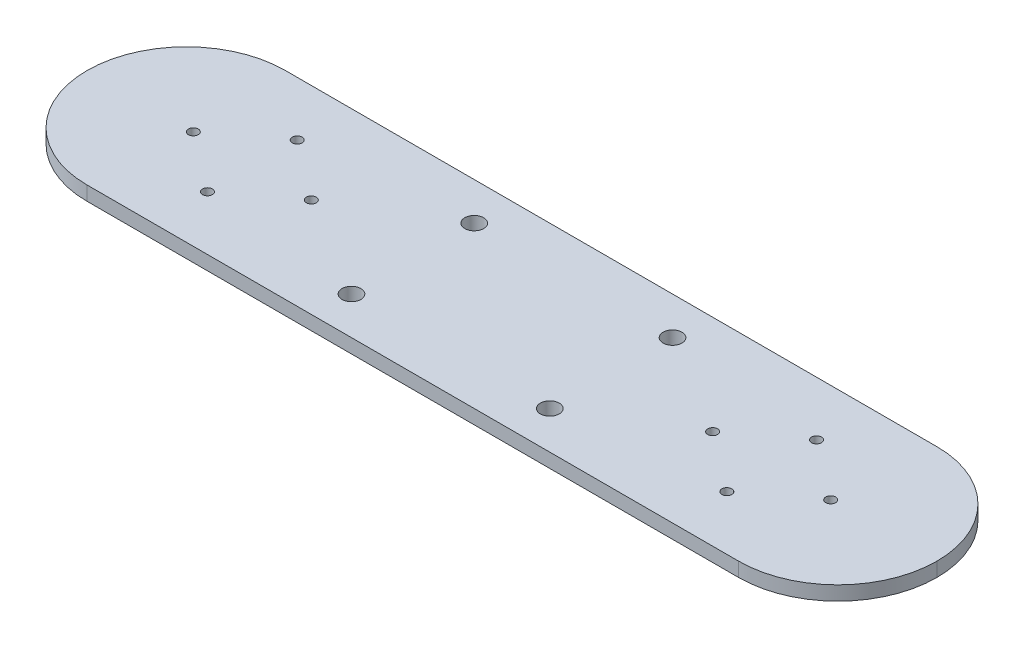
ISO-10303-21;
HEADER;
FILE_DESCRIPTION(('STEP AP214'),'2;1');
FILE_NAME('part.step','',(''),(''),'','','');
FILE_SCHEMA(('AUTOMOTIVE_DESIGN { 1 0 10303 214 1 1 1 1 }'));
ENDSEC;
DATA;
#1=APPLICATION_CONTEXT('core data for automotive mechanical design processes');
#2=APPLICATION_PROTOCOL_DEFINITION('international standard','automotive_design',2000,#1);
#3=PRODUCT_CONTEXT('',#1,'mechanical');
#4=PRODUCT('Part','Part','',(#3));
#5=PRODUCT_RELATED_PRODUCT_CATEGORY('part','',(#4));
#6=PRODUCT_DEFINITION_FORMATION('','',#4);
#7=PRODUCT_DEFINITION_CONTEXT('part definition',#1,'design');
#8=PRODUCT_DEFINITION('design','',#6,#7);
#9=PRODUCT_DEFINITION_SHAPE('','',#8);
#10=(LENGTH_UNIT() NAMED_UNIT(*) SI_UNIT(.MILLI.,.METRE.));
#11=(NAMED_UNIT(*) PLANE_ANGLE_UNIT() SI_UNIT($,.RADIAN.));
#12=(NAMED_UNIT(*) SI_UNIT($,.STERADIAN.) SOLID_ANGLE_UNIT());
#13=UNCERTAINTY_MEASURE_WITH_UNIT(LENGTH_MEASURE(1.E-05),#10,'distance_accuracy_value','');
#14=(GEOMETRIC_REPRESENTATION_CONTEXT(3) GLOBAL_UNCERTAINTY_ASSIGNED_CONTEXT((#13)) GLOBAL_UNIT_ASSIGNED_CONTEXT((#10,
#11,#12)) REPRESENTATION_CONTEXT('',''));
#15=CARTESIAN_POINT('',(0.,0.,0.));
#16=DIRECTION('',(0.,0.,1.));
#17=DIRECTION('',(1.,0.,0.));
#18=AXIS2_PLACEMENT_3D('',#15,#16,#17);
#19=CARTESIAN_POINT('',(-89.9999999999999,1.5,21.));
#20=DIRECTION('',(0.,-1.,0.));
#21=DIRECTION('',(0.,0.,-1.));
#22=AXIS2_PLACEMENT_3D('',#19,#20,#21);
#23=PLANE('',#22);
#24=CARTESIAN_POINT('',(-55.,1.5,9.5));
#25=DIRECTION('',(0.,-1.,0.));
#26=DIRECTION('',(0.,0.,1.));
#27=AXIS2_PLACEMENT_3D('',#24,#25,#26);
#28=CIRCLE('',#27,1.04999999999999);
#29=CARTESIAN_POINT('',(-55.,1.5,10.55));
#30=VERTEX_POINT('',#29);
#31=EDGE_CURVE('E232',#30,#30,#28,.T.);
#32=ORIENTED_EDGE('',*,*,#31,.T.);
#33=EDGE_LOOP('',(#32));
#34=FACE_BOUND('',#33,.T.);
#35=CARTESIAN_POINT('',(-42.5,1.5,0.));
#36=DIRECTION('',(0.,-1.,0.));
#37=DIRECTION('',(0.,0.,1.));
#38=AXIS2_PLACEMENT_3D('',#35,#36,#37);
#39=CIRCLE('',#38,1.05);
#40=CARTESIAN_POINT('',(-42.5,1.5,1.05));
#41=VERTEX_POINT('',#40);
#42=EDGE_CURVE('E230',#41,#41,#39,.T.);
#43=ORIENTED_EDGE('',*,*,#42,.T.);
#44=EDGE_LOOP('',(#43));
#45=FACE_BOUND('',#44,.T.);
#46=CARTESIAN_POINT('',(-67.5,1.5,0.));
#47=DIRECTION('',(0.,-1.,0.));
#48=DIRECTION('',(0.,0.,1.));
#49=AXIS2_PLACEMENT_3D('',#46,#47,#48);
#50=CIRCLE('',#49,1.04999999999999);
#51=CARTESIAN_POINT('',(-67.5,1.5,1.04999999999999));
#52=VERTEX_POINT('',#51);
#53=EDGE_CURVE('E135',#52,#52,#50,.T.);
#54=ORIENTED_EDGE('',*,*,#53,.T.);
#55=EDGE_LOOP('',(#54));
#56=FACE_BOUND('',#55,.T.);
#57=CARTESIAN_POINT('',(-55.,1.5,-9.5));
#58=DIRECTION('',(0.,-1.,0.));
#59=DIRECTION('',(0.,0.,1.));
#60=AXIS2_PLACEMENT_3D('',#57,#58,#59);
#61=CIRCLE('',#60,1.04999999999999);
#62=CARTESIAN_POINT('',(-55.,1.5,-8.45));
#63=VERTEX_POINT('',#62);
#64=EDGE_CURVE('E242',#63,#63,#61,.T.);
#65=ORIENTED_EDGE('',*,*,#64,.T.);
#66=EDGE_LOOP('',(#65));
#67=FACE_BOUND('',#66,.T.);
#68=CARTESIAN_POINT('',(55.,1.5,9.5));
#69=DIRECTION('',(0.,1.,0.));
#70=DIRECTION('',(0.,0.,1.));
#71=AXIS2_PLACEMENT_3D('',#68,#69,#70);
#72=CIRCLE('',#71,1.04999999999999);
#73=CARTESIAN_POINT('',(55.,1.5,10.55));
#74=VERTEX_POINT('',#73);
#75=EDGE_CURVE('E250',#74,#74,#72,.T.);
#76=ORIENTED_EDGE('',*,*,#75,.F.);
#77=EDGE_LOOP('',(#76));
#78=FACE_BOUND('',#77,.T.);
#79=CARTESIAN_POINT('',(42.5,1.5,0.));
#80=DIRECTION('',(0.,1.,0.));
#81=DIRECTION('',(0.,0.,1.));
#82=AXIS2_PLACEMENT_3D('',#79,#80,#81);
#83=CIRCLE('',#82,1.05);
#84=CARTESIAN_POINT('',(42.5,1.5,1.05));
#85=VERTEX_POINT('',#84);
#86=EDGE_CURVE('E256',#85,#85,#83,.T.);
#87=ORIENTED_EDGE('',*,*,#86,.F.);
#88=EDGE_LOOP('',(#87));
#89=FACE_BOUND('',#88,.T.);
#90=CARTESIAN_POINT('',(67.5,1.5,0.));
#91=DIRECTION('',(0.,1.,0.));
#92=DIRECTION('',(0.,0.,1.));
#93=AXIS2_PLACEMENT_3D('',#90,#91,#92);
#94=CIRCLE('',#93,1.04999999999999);
#95=CARTESIAN_POINT('',(67.5,1.5,1.04999999999999));
#96=VERTEX_POINT('',#95);
#97=EDGE_CURVE('E241',#96,#96,#94,.T.);
#98=ORIENTED_EDGE('',*,*,#97,.F.);
#99=EDGE_LOOP('',(#98));
#100=FACE_BOUND('',#99,.T.);
#101=CARTESIAN_POINT('',(55.,1.5,-9.5));
#102=DIRECTION('',(0.,1.,0.));
#103=DIRECTION('',(0.,0.,1.));
#104=AXIS2_PLACEMENT_3D('',#101,#102,#103);
#105=CIRCLE('',#104,1.04999999999999);
#106=CARTESIAN_POINT('',(55.,1.5,-8.45));
#107=VERTEX_POINT('',#106);
#108=EDGE_CURVE('E249',#107,#107,#105,.T.);
#109=ORIENTED_EDGE('',*,*,#108,.F.);
#110=EDGE_LOOP('',(#109));
#111=FACE_BOUND('',#110,.T.);
#112=CARTESIAN_POINT('',(21.,1.5,-13.));
#113=DIRECTION('',(0.,1.,0.));
#114=DIRECTION('',(0.,0.,1.));
#115=AXIS2_PLACEMENT_3D('',#112,#113,#114);
#116=CIRCLE('',#115,2.);
#117=CARTESIAN_POINT('',(21.,1.5,-11.));
#118=VERTEX_POINT('',#117);
#119=EDGE_CURVE('E273',#118,#118,#116,.T.);
#120=ORIENTED_EDGE('',*,*,#119,.F.);
#121=EDGE_LOOP('',(#120));
#122=FACE_BOUND('',#121,.T.);
#123=CARTESIAN_POINT('',(21.,1.5,13.));
#124=DIRECTION('',(0.,1.,0.));
#125=DIRECTION('',(0.,0.,1.));
#126=AXIS2_PLACEMENT_3D('',#123,#124,#125);
#127=CIRCLE('',#126,2.);
#128=CARTESIAN_POINT('',(21.,1.5,15.));
#129=VERTEX_POINT('',#128);
#130=EDGE_CURVE('E279',#129,#129,#127,.T.);
#131=ORIENTED_EDGE('',*,*,#130,.F.);
#132=EDGE_LOOP('',(#131));
#133=FACE_BOUND('',#132,.T.);
#134=CARTESIAN_POINT('',(-21.,1.5,13.));
#135=DIRECTION('',(0.,1.,0.));
#136=DIRECTION('',(0.,0.,1.));
#137=AXIS2_PLACEMENT_3D('',#134,#135,#136);
#138=CIRCLE('',#137,2.);
#139=CARTESIAN_POINT('',(-21.,1.5,15.));
#140=VERTEX_POINT('',#139);
#141=EDGE_CURVE('E267',#140,#140,#138,.T.);
#142=ORIENTED_EDGE('',*,*,#141,.F.);
#143=EDGE_LOOP('',(#142));
#144=FACE_BOUND('',#143,.T.);
#145=CARTESIAN_POINT('',(-21.,1.5,-13.));
#146=DIRECTION('',(0.,1.,0.));
#147=DIRECTION('',(0.,0.,1.));
#148=AXIS2_PLACEMENT_3D('',#145,#146,#147);
#149=CIRCLE('',#148,2.);
#150=CARTESIAN_POINT('',(-21.,1.5,-11.));
#151=VERTEX_POINT('',#150);
#152=EDGE_CURVE('E119',#151,#151,#149,.T.);
#153=ORIENTED_EDGE('',*,*,#152,.F.);
#154=EDGE_LOOP('',(#153));
#155=FACE_BOUND('',#154,.T.);
#156=CARTESIAN_POINT('',(-68.9999999999999,1.5,0.));
#157=DIRECTION('',(0.,-1.,0.));
#158=DIRECTION('',(0.,0.,-1.));
#159=AXIS2_PLACEMENT_3D('',#156,#157,#158);
#160=CIRCLE('',#159,21.);
#161=CARTESIAN_POINT('',(-68.9999999999999,1.5,-21.));
#162=VERTEX_POINT('',#161);
#163=CARTESIAN_POINT('',(-89.9999999999999,1.5,0.));
#164=VERTEX_POINT('',#163);
#165=EDGE_CURVE('E98',#162,#164,#160,.F.);
#166=ORIENTED_EDGE('',*,*,#165,.T.);
#167=CARTESIAN_POINT('',(-68.9999999999999,1.5,0.));
#168=DIRECTION('',(0.,-1.,0.));
#169=DIRECTION('',(0.,0.,-1.));
#170=AXIS2_PLACEMENT_3D('',#167,#168,#169);
#171=CIRCLE('',#170,21.);
#172=CARTESIAN_POINT('',(-68.9999999999999,1.5,21.));
#173=VERTEX_POINT('',#172);
#174=EDGE_CURVE('E112',#164,#173,#171,.F.);
#175=ORIENTED_EDGE('',*,*,#174,.T.);
#176=DIRECTION('',(-1.,0.,0.));
#177=VECTOR('',#176,1.);
#178=CARTESIAN_POINT('',(-89.9999999999999,1.5,21.));
#179=LINE('',#178,#177);
#180=CARTESIAN_POINT('',(69.,1.5,21.));
#181=VERTEX_POINT('',#180);
#182=EDGE_CURVE('E106',#181,#173,#179,.T.);
#183=ORIENTED_EDGE('',*,*,#182,.F.);
#184=CARTESIAN_POINT('',(69.0000000000001,1.5,0.));
#185=DIRECTION('',(0.,-1.,0.));
#186=DIRECTION('',(0.,0.,-1.));
#187=AXIS2_PLACEMENT_3D('',#184,#185,#186);
#188=CIRCLE('',#187,21.);
#189=CARTESIAN_POINT('',(90.0000000000001,1.5,0.));
#190=VERTEX_POINT('',#189);
#191=EDGE_CURVE('E89',#181,#190,#188,.F.);
#192=ORIENTED_EDGE('',*,*,#191,.T.);
#193=CARTESIAN_POINT('',(69.0000000000001,1.5,0.));
#194=DIRECTION('',(0.,-1.,0.));
#195=DIRECTION('',(0.,0.,-1.));
#196=AXIS2_PLACEMENT_3D('',#193,#194,#195);
#197=CIRCLE('',#196,21.);
#198=CARTESIAN_POINT('',(69.,1.5,-21.));
#199=VERTEX_POINT('',#198);
#200=EDGE_CURVE('E99',#190,#199,#197,.F.);
#201=ORIENTED_EDGE('',*,*,#200,.T.);
#202=DIRECTION('',(-1.,0.,0.));
#203=VECTOR('',#202,1.);
#204=CARTESIAN_POINT('',(-89.9999999999999,1.5,-21.));
#205=LINE('',#204,#203);
#206=EDGE_CURVE('E116',#199,#162,#205,.T.);
#207=ORIENTED_EDGE('',*,*,#206,.T.);
#208=EDGE_LOOP('',(#166,#175,#183,#192,#201,#207));
#209=FACE_BOUND('',#208,.T.);
#210=ADVANCED_FACE('F35',(#34,#45,#56,#67,#78,#89,#100,#111,#122,#133,#144,#155,#209),#23,.F.);
#211=CARTESIAN_POINT('',(-89.9999999999999,-1.5,21.));
#212=DIRECTION('',(0.,1.,0.));
#213=DIRECTION('',(0.,0.,1.));
#214=AXIS2_PLACEMENT_3D('',#211,#212,#213);
#215=PLANE('',#214);
#216=CARTESIAN_POINT('',(-55.,-1.5,9.5));
#217=DIRECTION('',(0.,-1.,0.));
#218=DIRECTION('',(0.,0.,1.));
#219=AXIS2_PLACEMENT_3D('',#216,#217,#218);
#220=CIRCLE('',#219,1.04999999999999);
#221=CARTESIAN_POINT('',(-55.,-1.5,10.55));
#222=VERTEX_POINT('',#221);
#223=EDGE_CURVE('E245',#222,#222,#220,.T.);
#224=ORIENTED_EDGE('',*,*,#223,.F.);
#225=EDGE_LOOP('',(#224));
#226=FACE_BOUND('',#225,.T.);
#227=CARTESIAN_POINT('',(-42.5,-1.5,0.));
#228=DIRECTION('',(0.,-1.,0.));
#229=DIRECTION('',(0.,0.,1.));
#230=AXIS2_PLACEMENT_3D('',#227,#228,#229);
#231=CIRCLE('',#230,1.05);
#232=CARTESIAN_POINT('',(-42.5,-1.5,1.05));
#233=VERTEX_POINT('',#232);
#234=EDGE_CURVE('E227',#233,#233,#231,.T.);
#235=ORIENTED_EDGE('',*,*,#234,.F.);
#236=EDGE_LOOP('',(#235));
#237=FACE_BOUND('',#236,.T.);
#238=CARTESIAN_POINT('',(-67.5,-1.5,0.));
#239=DIRECTION('',(0.,-1.,0.));
#240=DIRECTION('',(0.,0.,1.));
#241=AXIS2_PLACEMENT_3D('',#238,#239,#240);
#242=CIRCLE('',#241,1.04999999999999);
#243=CARTESIAN_POINT('',(-67.5,-1.5,1.04999999999999));
#244=VERTEX_POINT('',#243);
#245=EDGE_CURVE('E137',#244,#244,#242,.T.);
#246=ORIENTED_EDGE('',*,*,#245,.F.);
#247=EDGE_LOOP('',(#246));
#248=FACE_BOUND('',#247,.T.);
#249=CARTESIAN_POINT('',(-55.,-1.5,-9.5));
#250=DIRECTION('',(0.,-1.,0.));
#251=DIRECTION('',(0.,0.,1.));
#252=AXIS2_PLACEMENT_3D('',#249,#250,#251);
#253=CIRCLE('',#252,1.04999999999999);
#254=CARTESIAN_POINT('',(-55.,-1.5,-8.45));
#255=VERTEX_POINT('',#254);
#256=EDGE_CURVE('E238',#255,#255,#253,.T.);
#257=ORIENTED_EDGE('',*,*,#256,.F.);
#258=EDGE_LOOP('',(#257));
#259=FACE_BOUND('',#258,.T.);
#260=CARTESIAN_POINT('',(55.,-1.5,9.5));
#261=DIRECTION('',(0.,1.,0.));
#262=DIRECTION('',(0.,0.,1.));
#263=AXIS2_PLACEMENT_3D('',#260,#261,#262);
#264=CIRCLE('',#263,1.04999999999999);
#265=CARTESIAN_POINT('',(55.,-1.5,10.55));
#266=VERTEX_POINT('',#265);
#267=EDGE_CURVE('E246',#266,#266,#264,.T.);
#268=ORIENTED_EDGE('',*,*,#267,.T.);
#269=EDGE_LOOP('',(#268));
#270=FACE_BOUND('',#269,.T.);
#271=CARTESIAN_POINT('',(42.5,-1.5,0.));
#272=DIRECTION('',(0.,1.,0.));
#273=DIRECTION('',(0.,0.,1.));
#274=AXIS2_PLACEMENT_3D('',#271,#272,#273);
#275=CIRCLE('',#274,1.05);
#276=CARTESIAN_POINT('',(42.5,-1.5,1.05));
#277=VERTEX_POINT('',#276);
#278=EDGE_CURVE('E253',#277,#277,#275,.T.);
#279=ORIENTED_EDGE('',*,*,#278,.T.);
#280=EDGE_LOOP('',(#279));
#281=FACE_BOUND('',#280,.T.);
#282=CARTESIAN_POINT('',(67.5,-1.5,0.));
#283=DIRECTION('',(0.,1.,0.));
#284=DIRECTION('',(0.,0.,1.));
#285=AXIS2_PLACEMENT_3D('',#282,#283,#284);
#286=CIRCLE('',#285,1.04999999999999);
#287=CARTESIAN_POINT('',(67.5,-1.5,1.04999999999999));
#288=VERTEX_POINT('',#287);
#289=EDGE_CURVE('E259',#288,#288,#286,.T.);
#290=ORIENTED_EDGE('',*,*,#289,.T.);
#291=EDGE_LOOP('',(#290));
#292=FACE_BOUND('',#291,.T.);
#293=CARTESIAN_POINT('',(55.,-1.5,-9.5));
#294=DIRECTION('',(0.,1.,0.));
#295=DIRECTION('',(0.,0.,1.));
#296=AXIS2_PLACEMENT_3D('',#293,#294,#295);
#297=CIRCLE('',#296,1.04999999999999);
#298=CARTESIAN_POINT('',(55.,-1.5,-8.45));
#299=VERTEX_POINT('',#298);
#300=EDGE_CURVE('E264',#299,#299,#297,.T.);
#301=ORIENTED_EDGE('',*,*,#300,.T.);
#302=EDGE_LOOP('',(#301));
#303=FACE_BOUND('',#302,.T.);
#304=CARTESIAN_POINT('',(21.,-1.5,-13.));
#305=DIRECTION('',(0.,1.,0.));
#306=DIRECTION('',(0.,0.,1.));
#307=AXIS2_PLACEMENT_3D('',#304,#305,#306);
#308=CIRCLE('',#307,2.);
#309=CARTESIAN_POINT('',(21.,-1.5,-11.));
#310=VERTEX_POINT('',#309);
#311=EDGE_CURVE('E270',#310,#310,#308,.T.);
#312=ORIENTED_EDGE('',*,*,#311,.T.);
#313=EDGE_LOOP('',(#312));
#314=FACE_BOUND('',#313,.T.);
#315=CARTESIAN_POINT('',(21.,-1.5,13.));
#316=DIRECTION('',(0.,1.,0.));
#317=DIRECTION('',(0.,0.,1.));
#318=AXIS2_PLACEMENT_3D('',#315,#316,#317);
#319=CIRCLE('',#318,2.);
#320=CARTESIAN_POINT('',(21.,-1.5,15.));
#321=VERTEX_POINT('',#320);
#322=EDGE_CURVE('E276',#321,#321,#319,.T.);
#323=ORIENTED_EDGE('',*,*,#322,.T.);
#324=EDGE_LOOP('',(#323));
#325=FACE_BOUND('',#324,.T.);
#326=CARTESIAN_POINT('',(-21.,-1.5,13.));
#327=DIRECTION('',(0.,1.,0.));
#328=DIRECTION('',(0.,0.,1.));
#329=AXIS2_PLACEMENT_3D('',#326,#327,#328);
#330=CIRCLE('',#329,2.);
#331=CARTESIAN_POINT('',(-21.,-1.5,15.));
#332=VERTEX_POINT('',#331);
#333=EDGE_CURVE('E282',#332,#332,#330,.T.);
#334=ORIENTED_EDGE('',*,*,#333,.T.);
#335=EDGE_LOOP('',(#334));
#336=FACE_BOUND('',#335,.T.);
#337=CARTESIAN_POINT('',(-21.,-1.5,-13.));
#338=DIRECTION('',(0.,1.,0.));
#339=DIRECTION('',(0.,0.,1.));
#340=AXIS2_PLACEMENT_3D('',#337,#338,#339);
#341=CIRCLE('',#340,2.);
#342=CARTESIAN_POINT('',(-21.,-1.5,-11.));
#343=VERTEX_POINT('',#342);
#344=EDGE_CURVE('E123',#343,#343,#341,.T.);
#345=ORIENTED_EDGE('',*,*,#344,.T.);
#346=EDGE_LOOP('',(#345));
#347=FACE_BOUND('',#346,.T.);
#348=DIRECTION('',(1.,0.,0.));
#349=VECTOR('',#348,1.);
#350=CARTESIAN_POINT('',(-89.9999999999999,-1.5,21.));
#351=LINE('',#350,#349);
#352=CARTESIAN_POINT('',(-68.9999999999999,-1.5,21.));
#353=VERTEX_POINT('',#352);
#354=CARTESIAN_POINT('',(69.,-1.5,21.));
#355=VERTEX_POINT('',#354);
#356=EDGE_CURVE('E108',#353,#355,#351,.T.);
#357=ORIENTED_EDGE('',*,*,#356,.F.);
#358=CARTESIAN_POINT('',(-68.9999999999999,-1.5,0.));
#359=DIRECTION('',(0.,1.,0.));
#360=DIRECTION('',(0.,0.,1.));
#361=AXIS2_PLACEMENT_3D('',#358,#359,#360);
#362=CIRCLE('',#361,21.);
#363=CARTESIAN_POINT('',(-89.9999999999999,-1.5,0.));
#364=VERTEX_POINT('',#363);
#365=EDGE_CURVE('E52',#353,#364,#362,.F.);
#366=ORIENTED_EDGE('',*,*,#365,.T.);
#367=CARTESIAN_POINT('',(-68.9999999999999,-1.5,0.));
#368=DIRECTION('',(0.,1.,0.));
#369=DIRECTION('',(0.,0.,1.));
#370=AXIS2_PLACEMENT_3D('',#367,#368,#369);
#371=CIRCLE('',#370,21.);
#372=CARTESIAN_POINT('',(-68.9999999999999,-1.5,-21.));
#373=VERTEX_POINT('',#372);
#374=EDGE_CURVE('E132',#364,#373,#371,.F.);
#375=ORIENTED_EDGE('',*,*,#374,.T.);
#376=DIRECTION('',(1.,0.,0.));
#377=VECTOR('',#376,1.);
#378=CARTESIAN_POINT('',(-89.9999999999999,-1.5,-21.));
#379=LINE('',#378,#377);
#380=CARTESIAN_POINT('',(69.,-1.5,-21.));
#381=VERTEX_POINT('',#380);
#382=EDGE_CURVE('E113',#373,#381,#379,.T.);
#383=ORIENTED_EDGE('',*,*,#382,.T.);
#384=CARTESIAN_POINT('',(69.0000000000001,-1.5,0.));
#385=DIRECTION('',(0.,1.,0.));
#386=DIRECTION('',(0.,0.,1.));
#387=AXIS2_PLACEMENT_3D('',#384,#385,#386);
#388=CIRCLE('',#387,21.);
#389=CARTESIAN_POINT('',(90.0000000000001,-1.5,0.));
#390=VERTEX_POINT('',#389);
#391=EDGE_CURVE('E59',#381,#390,#388,.F.);
#392=ORIENTED_EDGE('',*,*,#391,.T.);
#393=CARTESIAN_POINT('',(69.0000000000001,-1.5,0.));
#394=DIRECTION('',(0.,1.,0.));
#395=DIRECTION('',(0.,0.,1.));
#396=AXIS2_PLACEMENT_3D('',#393,#394,#395);
#397=CIRCLE('',#396,21.);
#398=EDGE_CURVE('E130',#390,#355,#397,.F.);
#399=ORIENTED_EDGE('',*,*,#398,.T.);
#400=EDGE_LOOP('',(#357,#366,#375,#383,#392,#399));
#401=FACE_BOUND('',#400,.T.);
#402=ADVANCED_FACE('F147',(#226,#237,#248,#259,#270,#281,#292,#303,#314,#325,#336,#347,#401),
#215,.F.);
#403=CARTESIAN_POINT('',(0.,0.,21.));
#404=DIRECTION('',(0.,0.,-1.));
#405=DIRECTION('',(-1.,0.,0.));
#406=AXIS2_PLACEMENT_3D('',#403,#404,#405);
#407=PLANE('',#406);
#408=ORIENTED_EDGE('',*,*,#356,.T.);
#409=DIRECTION('',(0.,1.,0.));
#410=VECTOR('',#409,1.);
#411=CARTESIAN_POINT('',(69.0000000000001,0.,21.));
#412=LINE('',#411,#410);
#413=EDGE_CURVE('E93',#355,#181,#412,.T.);
#414=ORIENTED_EDGE('',*,*,#413,.T.);
#415=ORIENTED_EDGE('',*,*,#182,.T.);
#416=DIRECTION('',(0.,-1.,0.));
#417=VECTOR('',#416,1.);
#418=CARTESIAN_POINT('',(-68.9999999999999,0.,21.));
#419=LINE('',#418,#417);
#420=EDGE_CURVE('E109',#173,#353,#419,.T.);
#421=ORIENTED_EDGE('',*,*,#420,.T.);
#422=EDGE_LOOP('',(#408,#414,#415,#421));
#423=FACE_BOUND('',#422,.T.);
#424=ADVANCED_FACE('F104',(#423),#407,.F.);
#425=CARTESIAN_POINT('',(0.,0.,-21.));
#426=DIRECTION('',(0.,0.,-1.));
#427=DIRECTION('',(-1.,0.,0.));
#428=AXIS2_PLACEMENT_3D('',#425,#426,#427);
#429=PLANE('',#428);
#430=ORIENTED_EDGE('',*,*,#382,.F.);
#431=DIRECTION('',(0.,-1.,0.));
#432=VECTOR('',#431,1.);
#433=CARTESIAN_POINT('',(-68.9999999999999,1.5,-21.));
#434=LINE('',#433,#432);
#435=EDGE_CURVE('E11',#373,#162,#434,.F.);
#436=ORIENTED_EDGE('',*,*,#435,.T.);
#437=ORIENTED_EDGE('',*,*,#206,.F.);
#438=DIRECTION('',(0.,1.,0.));
#439=VECTOR('',#438,1.);
#440=CARTESIAN_POINT('',(69.0000000000001,-1.5,-21.));
#441=LINE('',#440,#439);
#442=EDGE_CURVE('E44',#199,#381,#441,.F.);
#443=ORIENTED_EDGE('',*,*,#442,.T.);
#444=EDGE_LOOP('',(#430,#436,#437,#443));
#445=FACE_BOUND('',#444,.T.);
#446=ADVANCED_FACE('F149',(#445),#429,.T.);
#447=CARTESIAN_POINT('',(-21.,-1.5,-13.));
#448=DIRECTION('',(0.,1.,0.));
#449=DIRECTION('',(0.,0.,1.));
#450=AXIS2_PLACEMENT_3D('',#447,#448,#449);
#451=CYLINDRICAL_SURFACE('',#450,2.);
#452=ORIENTED_EDGE('',*,*,#344,.F.);
#453=EDGE_LOOP('',(#452));
#454=FACE_BOUND('',#453,.T.);
#455=ORIENTED_EDGE('',*,*,#152,.T.);
#456=EDGE_LOOP('',(#455));
#457=FACE_BOUND('',#456,.T.);
#458=ADVANCED_FACE('F178',(#454,#457),#451,.F.);
#459=CARTESIAN_POINT('',(-21.,-1.5,13.));
#460=DIRECTION('',(0.,1.,0.));
#461=DIRECTION('',(0.,0.,1.));
#462=AXIS2_PLACEMENT_3D('',#459,#460,#461);
#463=CYLINDRICAL_SURFACE('',#462,2.);
#464=ORIENTED_EDGE('',*,*,#333,.F.);
#465=EDGE_LOOP('',(#464));
#466=FACE_BOUND('',#465,.T.);
#467=ORIENTED_EDGE('',*,*,#141,.T.);
#468=EDGE_LOOP('',(#467));
#469=FACE_BOUND('',#468,.T.);
#470=ADVANCED_FACE('F183',(#466,#469),#463,.F.);
#471=CARTESIAN_POINT('',(21.,-1.5,13.));
#472=DIRECTION('',(0.,1.,0.));
#473=DIRECTION('',(0.,0.,1.));
#474=AXIS2_PLACEMENT_3D('',#471,#472,#473);
#475=CYLINDRICAL_SURFACE('',#474,2.);
#476=ORIENTED_EDGE('',*,*,#322,.F.);
#477=EDGE_LOOP('',(#476));
#478=FACE_BOUND('',#477,.T.);
#479=ORIENTED_EDGE('',*,*,#130,.T.);
#480=EDGE_LOOP('',(#479));
#481=FACE_BOUND('',#480,.T.);
#482=ADVANCED_FACE('F187',(#478,#481),#475,.F.);
#483=CARTESIAN_POINT('',(21.,-1.5,-13.));
#484=DIRECTION('',(0.,1.,0.));
#485=DIRECTION('',(0.,0.,1.));
#486=AXIS2_PLACEMENT_3D('',#483,#484,#485);
#487=CYLINDRICAL_SURFACE('',#486,2.);
#488=ORIENTED_EDGE('',*,*,#311,.F.);
#489=EDGE_LOOP('',(#488));
#490=FACE_BOUND('',#489,.T.);
#491=ORIENTED_EDGE('',*,*,#119,.T.);
#492=EDGE_LOOP('',(#491));
#493=FACE_BOUND('',#492,.T.);
#494=ADVANCED_FACE('F191',(#490,#493),#487,.F.);
#495=CARTESIAN_POINT('',(55.,-1.5,-9.5));
#496=DIRECTION('',(0.,1.,0.));
#497=DIRECTION('',(0.,0.,1.));
#498=AXIS2_PLACEMENT_3D('',#495,#496,#497);
#499=CYLINDRICAL_SURFACE('',#498,1.04999999999999);
#500=ORIENTED_EDGE('',*,*,#300,.F.);
#501=EDGE_LOOP('',(#500));
#502=FACE_BOUND('',#501,.T.);
#503=ORIENTED_EDGE('',*,*,#108,.T.);
#504=EDGE_LOOP('',(#503));
#505=FACE_BOUND('',#504,.T.);
#506=ADVANCED_FACE('F195',(#502,#505),#499,.F.);
#507=CARTESIAN_POINT('',(67.5,-1.5,0.));
#508=DIRECTION('',(0.,1.,0.));
#509=DIRECTION('',(0.,0.,1.));
#510=AXIS2_PLACEMENT_3D('',#507,#508,#509);
#511=CYLINDRICAL_SURFACE('',#510,1.04999999999999);
#512=ORIENTED_EDGE('',*,*,#289,.F.);
#513=EDGE_LOOP('',(#512));
#514=FACE_BOUND('',#513,.T.);
#515=ORIENTED_EDGE('',*,*,#97,.T.);
#516=EDGE_LOOP('',(#515));
#517=FACE_BOUND('',#516,.T.);
#518=ADVANCED_FACE('F199',(#514,#517),#511,.F.);
#519=CARTESIAN_POINT('',(42.5,-1.5,0.));
#520=DIRECTION('',(0.,1.,0.));
#521=DIRECTION('',(0.,0.,1.));
#522=AXIS2_PLACEMENT_3D('',#519,#520,#521);
#523=CYLINDRICAL_SURFACE('',#522,1.05);
#524=ORIENTED_EDGE('',*,*,#278,.F.);
#525=EDGE_LOOP('',(#524));
#526=FACE_BOUND('',#525,.T.);
#527=ORIENTED_EDGE('',*,*,#86,.T.);
#528=EDGE_LOOP('',(#527));
#529=FACE_BOUND('',#528,.T.);
#530=ADVANCED_FACE('F203',(#526,#529),#523,.F.);
#531=CARTESIAN_POINT('',(55.,-1.5,9.5));
#532=DIRECTION('',(0.,1.,0.));
#533=DIRECTION('',(0.,0.,1.));
#534=AXIS2_PLACEMENT_3D('',#531,#532,#533);
#535=CYLINDRICAL_SURFACE('',#534,1.04999999999999);
#536=ORIENTED_EDGE('',*,*,#267,.F.);
#537=EDGE_LOOP('',(#536));
#538=FACE_BOUND('',#537,.T.);
#539=ORIENTED_EDGE('',*,*,#75,.T.);
#540=EDGE_LOOP('',(#539));
#541=FACE_BOUND('',#540,.T.);
#542=ADVANCED_FACE('F207',(#538,#541),#535,.F.);
#543=CARTESIAN_POINT('',(-55.,-1.5,-9.5));
#544=DIRECTION('',(0.,1.,0.));
#545=DIRECTION('',(0.,0.,1.));
#546=AXIS2_PLACEMENT_3D('',#543,#544,#545);
#547=CYLINDRICAL_SURFACE('',#546,1.04999999999999);
#548=ORIENTED_EDGE('',*,*,#256,.T.);
#549=EDGE_LOOP('',(#548));
#550=FACE_BOUND('',#549,.T.);
#551=ORIENTED_EDGE('',*,*,#64,.F.);
#552=EDGE_LOOP('',(#551));
#553=FACE_BOUND('',#552,.T.);
#554=ADVANCED_FACE('F211',(#550,#553),#547,.F.);
#555=CARTESIAN_POINT('',(-67.5,-1.5,0.));
#556=DIRECTION('',(0.,1.,0.));
#557=DIRECTION('',(0.,0.,1.));
#558=AXIS2_PLACEMENT_3D('',#555,#556,#557);
#559=CYLINDRICAL_SURFACE('',#558,1.04999999999999);
#560=ORIENTED_EDGE('',*,*,#245,.T.);
#561=EDGE_LOOP('',(#560));
#562=FACE_BOUND('',#561,.T.);
#563=ORIENTED_EDGE('',*,*,#53,.F.);
#564=EDGE_LOOP('',(#563));
#565=FACE_BOUND('',#564,.T.);
#566=ADVANCED_FACE('F215',(#562,#565),#559,.F.);
#567=CARTESIAN_POINT('',(-42.5,-1.5,0.));
#568=DIRECTION('',(0.,1.,0.));
#569=DIRECTION('',(0.,0.,1.));
#570=AXIS2_PLACEMENT_3D('',#567,#568,#569);
#571=CYLINDRICAL_SURFACE('',#570,1.05);
#572=ORIENTED_EDGE('',*,*,#234,.T.);
#573=EDGE_LOOP('',(#572));
#574=FACE_BOUND('',#573,.T.);
#575=ORIENTED_EDGE('',*,*,#42,.F.);
#576=EDGE_LOOP('',(#575));
#577=FACE_BOUND('',#576,.T.);
#578=ADVANCED_FACE('F162',(#574,#577),#571,.F.);
#579=CARTESIAN_POINT('',(-55.,-1.5,9.5));
#580=DIRECTION('',(0.,1.,0.));
#581=DIRECTION('',(0.,0.,1.));
#582=AXIS2_PLACEMENT_3D('',#579,#580,#581);
#583=CYLINDRICAL_SURFACE('',#582,1.04999999999999);
#584=ORIENTED_EDGE('',*,*,#223,.T.);
#585=EDGE_LOOP('',(#584));
#586=FACE_BOUND('',#585,.T.);
#587=ORIENTED_EDGE('',*,*,#31,.F.);
#588=EDGE_LOOP('',(#587));
#589=FACE_BOUND('',#588,.T.);
#590=ADVANCED_FACE('F155',(#586,#589),#583,.F.);
#591=CARTESIAN_POINT('',(69.0000000000001,-1.5,0.));
#592=DIRECTION('',(0.,-1.,0.));
#593=DIRECTION('',(0.,0.,-1.));
#594=AXIS2_PLACEMENT_3D('',#591,#592,#593);
#595=CYLINDRICAL_SURFACE('',#594,21.);
#596=DIRECTION('',(0.,1.,0.));
#597=VECTOR('',#596,1.);
#598=CARTESIAN_POINT('',(90.0000000000001,1.5,0.));
#599=LINE('',#598,#597);
#600=EDGE_CURVE('E94',#390,#190,#599,.T.);
#601=ORIENTED_EDGE('',*,*,#600,.F.);
#602=ORIENTED_EDGE('',*,*,#391,.F.);
#603=ORIENTED_EDGE('',*,*,#442,.F.);
#604=ORIENTED_EDGE('',*,*,#200,.F.);
#605=EDGE_LOOP('',(#601,#602,#603,#604));
#606=FACE_BOUND('',#605,.T.);
#607=ADVANCED_FACE('F153',(#606),#595,.T.);
#608=CARTESIAN_POINT('',(69.0000000000001,0.,0.));
#609=DIRECTION('',(0.,1.,0.));
#610=DIRECTION('',(0.,0.,1.));
#611=AXIS2_PLACEMENT_3D('',#608,#609,#610);
#612=CYLINDRICAL_SURFACE('',#611,21.);
#613=ORIENTED_EDGE('',*,*,#398,.F.);
#614=ORIENTED_EDGE('',*,*,#600,.T.);
#615=ORIENTED_EDGE('',*,*,#191,.F.);
#616=ORIENTED_EDGE('',*,*,#413,.F.);
#617=EDGE_LOOP('',(#613,#614,#615,#616));
#618=FACE_BOUND('',#617,.T.);
#619=ADVANCED_FACE('F92',(#618),#612,.T.);
#620=CARTESIAN_POINT('',(-68.9999999999999,-1.5,0.));
#621=DIRECTION('',(0.,1.,0.));
#622=DIRECTION('',(0.,0.,1.));
#623=AXIS2_PLACEMENT_3D('',#620,#621,#622);
#624=CYLINDRICAL_SURFACE('',#623,21.);
#625=DIRECTION('',(0.,-1.,0.));
#626=VECTOR('',#625,1.);
#627=CARTESIAN_POINT('',(-89.9999999999999,-1.5,0.));
#628=LINE('',#627,#626);
#629=EDGE_CURVE('E39',#164,#364,#628,.T.);
#630=ORIENTED_EDGE('',*,*,#629,.F.);
#631=ORIENTED_EDGE('',*,*,#165,.F.);
#632=ORIENTED_EDGE('',*,*,#435,.F.);
#633=ORIENTED_EDGE('',*,*,#374,.F.);
#634=EDGE_LOOP('',(#630,#631,#632,#633));
#635=FACE_BOUND('',#634,.T.);
#636=ADVANCED_FACE('F37',(#635),#624,.T.);
#637=CARTESIAN_POINT('',(-68.9999999999999,0.,0.));
#638=DIRECTION('',(0.,-1.,0.));
#639=DIRECTION('',(0.,0.,-1.));
#640=AXIS2_PLACEMENT_3D('',#637,#638,#639);
#641=CYLINDRICAL_SURFACE('',#640,21.);
#642=ORIENTED_EDGE('',*,*,#174,.F.);
#643=ORIENTED_EDGE('',*,*,#629,.T.);
#644=ORIENTED_EDGE('',*,*,#365,.F.);
#645=ORIENTED_EDGE('',*,*,#420,.F.);
#646=EDGE_LOOP('',(#642,#643,#644,#645));
#647=FACE_BOUND('',#646,.T.);
#648=ADVANCED_FACE('F142',(#647),#641,.T.);
#649=CLOSED_SHELL('',(#210,#402,#424,#446,#458,#470,#482,#494,#506,#518,#530,#542,#554,#566,
#578,#590,#607,#619,#636,#648));
#650=MANIFOLD_SOLID_BREP('B2',#649);
#651=ADVANCED_BREP_SHAPE_REPRESENTATION('',(#18,#650),#14);
#652=SHAPE_DEFINITION_REPRESENTATION(#9,#651);
ENDSEC;
END-ISO-10303-21;
